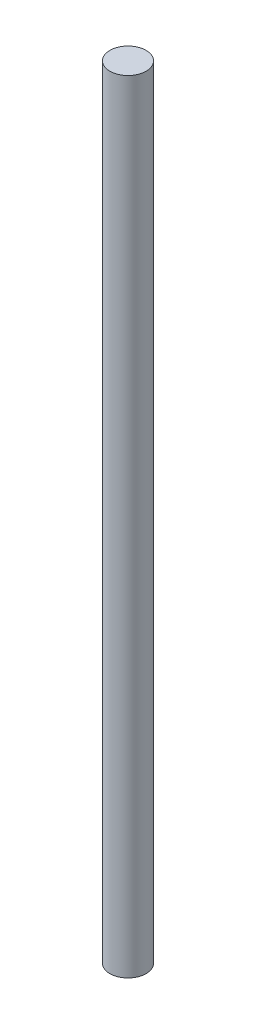
ISO-10303-21;
HEADER;
FILE_DESCRIPTION(('STEP AP214'),'2;1');
FILE_NAME('part.step','',(''),(''),'','','');
FILE_SCHEMA(('AUTOMOTIVE_DESIGN { 1 0 10303 214 1 1 1 1 }'));
ENDSEC;
DATA;
#1=APPLICATION_CONTEXT('core data for automotive mechanical design processes');
#2=APPLICATION_PROTOCOL_DEFINITION('international standard','automotive_design',2000,#1);
#3=PRODUCT_CONTEXT('',#1,'mechanical');
#4=PRODUCT('Part','Part','',(#3));
#5=PRODUCT_RELATED_PRODUCT_CATEGORY('part','',(#4));
#6=PRODUCT_DEFINITION_FORMATION('','',#4);
#7=PRODUCT_DEFINITION_CONTEXT('part definition',#1,'design');
#8=PRODUCT_DEFINITION('design','',#6,#7);
#9=PRODUCT_DEFINITION_SHAPE('','',#8);
#10=(LENGTH_UNIT() NAMED_UNIT(*) SI_UNIT(.MILLI.,.METRE.));
#11=(NAMED_UNIT(*) PLANE_ANGLE_UNIT() SI_UNIT($,.RADIAN.));
#12=(NAMED_UNIT(*) SI_UNIT($,.STERADIAN.) SOLID_ANGLE_UNIT());
#13=UNCERTAINTY_MEASURE_WITH_UNIT(LENGTH_MEASURE(1.E-05),#10,'distance_accuracy_value','');
#14=(GEOMETRIC_REPRESENTATION_CONTEXT(3) GLOBAL_UNCERTAINTY_ASSIGNED_CONTEXT((#13)) GLOBAL_UNIT_ASSIGNED_CONTEXT((#10,
#11,#12)) REPRESENTATION_CONTEXT('',''));
#15=CARTESIAN_POINT('',(0.,0.,0.));
#16=DIRECTION('',(0.,0.,1.));
#17=DIRECTION('',(1.,0.,0.));
#18=AXIS2_PLACEMENT_3D('',#15,#16,#17);
#19=CARTESIAN_POINT('',(0.,75.6,0.));
#20=DIRECTION('',(0.,-1.,0.));
#21=DIRECTION('',(0.,0.,-1.));
#22=AXIS2_PLACEMENT_3D('',#19,#20,#21);
#23=CYLINDRICAL_SURFACE('',#22,1.75);
#24=CARTESIAN_POINT('',(0.,75.6,0.));
#25=DIRECTION('',(0.,1.,0.));
#26=DIRECTION('',(0.,0.,1.));
#27=AXIS2_PLACEMENT_3D('',#24,#25,#26);
#28=CIRCLE('',#27,1.75);
#29=CARTESIAN_POINT('',(0.,75.6,1.75));
#30=VERTEX_POINT('',#29);
#31=EDGE_CURVE('E10',#30,#30,#28,.T.);
#32=ORIENTED_EDGE('',*,*,#31,.F.);
#33=EDGE_LOOP('',(#32));
#34=FACE_BOUND('',#33,.T.);
#35=CARTESIAN_POINT('',(0.,0.,0.));
#36=DIRECTION('',(0.,1.,0.));
#37=DIRECTION('',(0.,0.,1.));
#38=AXIS2_PLACEMENT_3D('',#35,#36,#37);
#39=CIRCLE('',#38,1.75);
#40=CARTESIAN_POINT('',(0.,0.,1.75));
#41=VERTEX_POINT('',#40);
#42=EDGE_CURVE('E35',#41,#41,#39,.T.);
#43=ORIENTED_EDGE('',*,*,#42,.T.);
#44=EDGE_LOOP('',(#43));
#45=FACE_BOUND('',#44,.T.);
#46=ADVANCED_FACE('F32',(#34,#45),#23,.T.);
#47=CARTESIAN_POINT('',(0.,75.6,0.));
#48=DIRECTION('',(0.,1.,0.));
#49=DIRECTION('',(0.,0.,1.));
#50=AXIS2_PLACEMENT_3D('',#47,#48,#49);
#51=PLANE('',#50);
#52=ORIENTED_EDGE('',*,*,#31,.T.);
#53=EDGE_LOOP('',(#52));
#54=FACE_BOUND('',#53,.T.);
#55=ADVANCED_FACE('F47',(#54),#51,.T.);
#56=CARTESIAN_POINT('',(0.,0.,0.));
#57=DIRECTION('',(0.,1.,0.));
#58=DIRECTION('',(0.,0.,1.));
#59=AXIS2_PLACEMENT_3D('',#56,#57,#58);
#60=PLANE('',#59);
#61=ORIENTED_EDGE('',*,*,#42,.F.);
#62=EDGE_LOOP('',(#61));
#63=FACE_BOUND('',#62,.T.);
#64=ADVANCED_FACE('F45',(#63),#60,.F.);
#65=CLOSED_SHELL('',(#46,#55,#64));
#66=MANIFOLD_SOLID_BREP('B2',#65);
#67=ADVANCED_BREP_SHAPE_REPRESENTATION('',(#18,#66),#14);
#68=SHAPE_DEFINITION_REPRESENTATION(#9,#67);
ENDSEC;
END-ISO-10303-21;
